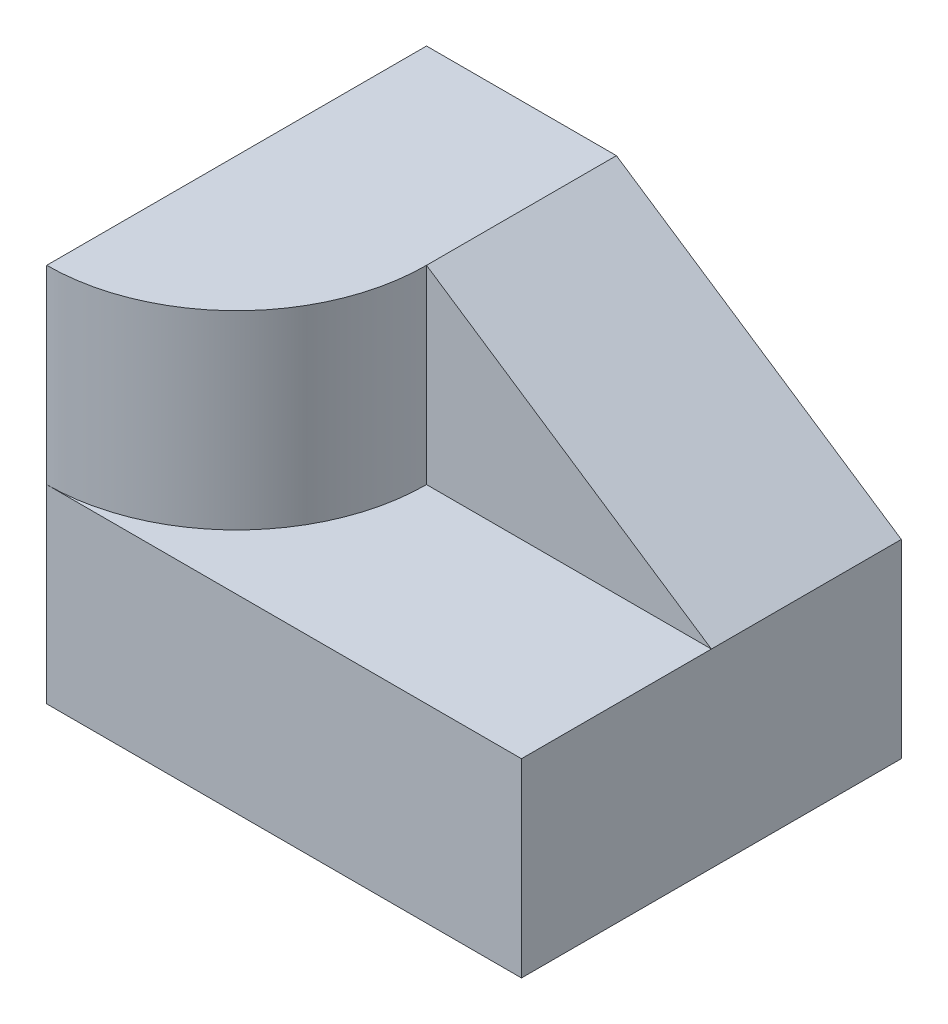
ISO-10303-21;
HEADER;
FILE_DESCRIPTION(('STEP AP214'),'2;1');
FILE_NAME('part.step','',(''),(''),'','','');
FILE_SCHEMA(('AUTOMOTIVE_DESIGN { 1 0 10303 214 1 1 1 1 }'));
ENDSEC;
DATA;
#1=APPLICATION_CONTEXT('core data for automotive mechanical design processes');
#2=APPLICATION_PROTOCOL_DEFINITION('international standard','automotive_design',2000,#1);
#3=PRODUCT_CONTEXT('',#1,'mechanical');
#4=PRODUCT('Part','Part','',(#3));
#5=PRODUCT_RELATED_PRODUCT_CATEGORY('part','',(#4));
#6=PRODUCT_DEFINITION_FORMATION('','',#4);
#7=PRODUCT_DEFINITION_CONTEXT('part definition',#1,'design');
#8=PRODUCT_DEFINITION('design','',#6,#7);
#9=PRODUCT_DEFINITION_SHAPE('','',#8);
#10=(LENGTH_UNIT() NAMED_UNIT(*) SI_UNIT(.MILLI.,.METRE.));
#11=(NAMED_UNIT(*) PLANE_ANGLE_UNIT() SI_UNIT($,.RADIAN.));
#12=(NAMED_UNIT(*) SI_UNIT($,.STERADIAN.) SOLID_ANGLE_UNIT());
#13=UNCERTAINTY_MEASURE_WITH_UNIT(LENGTH_MEASURE(1.E-05),#10,'distance_accuracy_value','');
#14=(GEOMETRIC_REPRESENTATION_CONTEXT(3) GLOBAL_UNCERTAINTY_ASSIGNED_CONTEXT((#13)) GLOBAL_UNIT_ASSIGNED_CONTEXT((#10,
#11,#12)) REPRESENTATION_CONTEXT('',''));
#15=CARTESIAN_POINT('',(0.,0.,0.));
#16=DIRECTION('',(0.,0.,1.));
#17=DIRECTION('',(1.,0.,0.));
#18=AXIS2_PLACEMENT_3D('',#15,#16,#17);
#19=CARTESIAN_POINT('',(0.,20.,0.));
#20=DIRECTION('',(0.,1.,0.));
#21=DIRECTION('',(0.,0.,1.));
#22=AXIS2_PLACEMENT_3D('',#19,#20,#21);
#23=PLANE('',#22);
#24=DIRECTION('',(-1.,0.,0.));
#25=VECTOR('',#24,1.);
#26=CARTESIAN_POINT('',(25.,20.,0.));
#27=LINE('',#26,#25);
#28=CARTESIAN_POINT('',(25.,20.,0.));
#29=VERTEX_POINT('',#28);
#30=CARTESIAN_POINT('',(-4.99999999999999,20.,-1.42247325030098E-13));
#31=VERTEX_POINT('',#30);
#32=EDGE_CURVE('E131',#29,#31,#27,.T.);
#33=ORIENTED_EDGE('',*,*,#32,.T.);
#34=CARTESIAN_POINT('',(-25.,20.,0.));
#35=DIRECTION('',(0.,1.,0.));
#36=DIRECTION('',(0.,0.,1.));
#37=AXIS2_PLACEMENT_3D('',#34,#35,#36);
#38=CIRCLE('',#37,20.);
#39=CARTESIAN_POINT('',(-25.,20.,20.));
#40=VERTEX_POINT('',#39);
#41=EDGE_CURVE('E106',#40,#31,#38,.T.);
#42=ORIENTED_EDGE('',*,*,#41,.F.);
#43=DIRECTION('',(1.,0.,0.));
#44=VECTOR('',#43,1.);
#45=CARTESIAN_POINT('',(-25.,20.,20.));
#46=LINE('',#45,#44);
#47=CARTESIAN_POINT('',(25.,20.,20.));
#48=VERTEX_POINT('',#47);
#49=EDGE_CURVE('E59',#40,#48,#46,.T.);
#50=ORIENTED_EDGE('',*,*,#49,.T.);
#51=DIRECTION('',(0.,0.,-1.));
#52=VECTOR('',#51,1.);
#53=CARTESIAN_POINT('',(25.,20.,-20.));
#54=LINE('',#53,#52);
#55=EDGE_CURVE('E142',#48,#29,#54,.T.);
#56=ORIENTED_EDGE('',*,*,#55,.T.);
#57=EDGE_LOOP('',(#33,#42,#50,#56));
#58=FACE_BOUND('',#57,.T.);
#59=ADVANCED_FACE('F36',(#58),#23,.T.);
#60=CARTESIAN_POINT('',(25.,20.,-20.));
#61=DIRECTION('',(-1.,0.,0.));
#62=DIRECTION('',(0.,0.,1.));
#63=AXIS2_PLACEMENT_3D('',#60,#61,#62);
#64=PLANE('',#63);
#65=DIRECTION('',(0.,0.,-1.));
#66=VECTOR('',#65,1.);
#67=CARTESIAN_POINT('',(25.,0.,-20.));
#68=LINE('',#67,#66);
#69=CARTESIAN_POINT('',(25.,0.,20.));
#70=VERTEX_POINT('',#69);
#71=CARTESIAN_POINT('',(25.,0.,-20.));
#72=VERTEX_POINT('',#71);
#73=EDGE_CURVE('E140',#70,#72,#68,.T.);
#74=ORIENTED_EDGE('',*,*,#73,.T.);
#75=DIRECTION('',(0.,-1.,0.));
#76=VECTOR('',#75,1.);
#77=CARTESIAN_POINT('',(25.,20.,-20.));
#78=LINE('',#77,#76);
#79=CARTESIAN_POINT('',(25.,20.,-20.));
#80=VERTEX_POINT('',#79);
#81=EDGE_CURVE('E11',#80,#72,#78,.T.);
#82=ORIENTED_EDGE('',*,*,#81,.F.);
#83=DIRECTION('',(0.,0.,-1.));
#84=VECTOR('',#83,1.);
#85=CARTESIAN_POINT('',(25.,20.,0.));
#86=LINE('',#85,#84);
#87=EDGE_CURVE('E51',#29,#80,#86,.T.);
#88=ORIENTED_EDGE('',*,*,#87,.F.);
#89=ORIENTED_EDGE('',*,*,#55,.F.);
#90=DIRECTION('',(0.,-1.,0.));
#91=VECTOR('',#90,1.);
#92=CARTESIAN_POINT('',(25.,20.,20.));
#93=LINE('',#92,#91);
#94=EDGE_CURVE('E145',#48,#70,#93,.T.);
#95=ORIENTED_EDGE('',*,*,#94,.T.);
#96=EDGE_LOOP('',(#74,#82,#88,#89,#95));
#97=FACE_BOUND('',#96,.T.);
#98=ADVANCED_FACE('F38',(#97),#64,.F.);
#99=CARTESIAN_POINT('',(-25.,20.,-20.));
#100=DIRECTION('',(0.,0.,1.));
#101=DIRECTION('',(1.,0.,0.));
#102=AXIS2_PLACEMENT_3D('',#99,#100,#101);
#103=PLANE('',#102);
#104=DIRECTION('',(-1.,0.,0.));
#105=VECTOR('',#104,1.);
#106=CARTESIAN_POINT('',(-25.,0.,-20.));
#107=LINE('',#106,#105);
#108=CARTESIAN_POINT('',(-25.,0.,-20.));
#109=VERTEX_POINT('',#108);
#110=EDGE_CURVE('E147',#72,#109,#107,.T.);
#111=ORIENTED_EDGE('',*,*,#110,.T.);
#112=DIRECTION('',(0.,-1.,0.));
#113=VECTOR('',#112,1.);
#114=CARTESIAN_POINT('',(-25.,20.,-20.));
#115=LINE('',#114,#113);
#116=CARTESIAN_POINT('',(-25.,40.,-20.));
#117=VERTEX_POINT('',#116);
#118=EDGE_CURVE('E44',#117,#109,#115,.T.);
#119=ORIENTED_EDGE('',*,*,#118,.F.);
#120=DIRECTION('',(1.,0.,0.));
#121=VECTOR('',#120,1.);
#122=CARTESIAN_POINT('',(-25.,40.,-20.));
#123=LINE('',#122,#121);
#124=CARTESIAN_POINT('',(-4.99999999999999,40.,-20.));
#125=VERTEX_POINT('',#124);
#126=EDGE_CURVE('E128',#117,#125,#123,.T.);
#127=ORIENTED_EDGE('',*,*,#126,.T.);
#128=DIRECTION('',(0.832050294337844,-0.554700196225229,0.));
#129=VECTOR('',#128,1.);
#130=CARTESIAN_POINT('',(-4.99999999999999,40.,-20.));
#131=LINE('',#130,#129);
#132=EDGE_CURVE('E127',#125,#80,#131,.T.);
#133=ORIENTED_EDGE('',*,*,#132,.T.);
#134=ORIENTED_EDGE('',*,*,#81,.T.);
#135=EDGE_LOOP('',(#111,#119,#127,#133,#134));
#136=FACE_BOUND('',#135,.T.);
#137=ADVANCED_FACE('F171',(#136),#103,.F.);
#138=CARTESIAN_POINT('',(-25.,20.,-20.));
#139=DIRECTION('',(1.,0.,0.));
#140=DIRECTION('',(0.,0.,-1.));
#141=AXIS2_PLACEMENT_3D('',#138,#139,#140);
#142=PLANE('',#141);
#143=DIRECTION('',(0.,0.,1.));
#144=VECTOR('',#143,1.);
#145=CARTESIAN_POINT('',(-25.,0.,-20.));
#146=LINE('',#145,#144);
#147=CARTESIAN_POINT('',(-25.,0.,20.));
#148=VERTEX_POINT('',#147);
#149=EDGE_CURVE('E149',#109,#148,#146,.T.);
#150=ORIENTED_EDGE('',*,*,#149,.T.);
#151=DIRECTION('',(0.,-1.,0.));
#152=VECTOR('',#151,1.);
#153=CARTESIAN_POINT('',(-25.,20.,20.));
#154=LINE('',#153,#152);
#155=EDGE_CURVE('E153',#40,#148,#154,.T.);
#156=ORIENTED_EDGE('',*,*,#155,.F.);
#157=DIRECTION('',(0.,-1.,0.));
#158=VECTOR('',#157,1.);
#159=CARTESIAN_POINT('',(-25.0000000000001,40.,20.));
#160=LINE('',#159,#158);
#161=CARTESIAN_POINT('',(-25.0000000000001,40.,20.));
#162=VERTEX_POINT('',#161);
#163=EDGE_CURVE('E110',#162,#40,#160,.T.);
#164=ORIENTED_EDGE('',*,*,#163,.F.);
#165=DIRECTION('',(0.,0.,-1.));
#166=VECTOR('',#165,1.);
#167=CARTESIAN_POINT('',(-25.0000000000001,40.,20.));
#168=LINE('',#167,#166);
#169=EDGE_CURVE('E111',#162,#117,#168,.T.);
#170=ORIENTED_EDGE('',*,*,#169,.T.);
#171=ORIENTED_EDGE('',*,*,#118,.T.);
#172=EDGE_LOOP('',(#150,#156,#164,#170,#171));
#173=FACE_BOUND('',#172,.T.);
#174=ADVANCED_FACE('F157',(#173),#142,.F.);
#175=CARTESIAN_POINT('',(-25.,20.,20.));
#176=DIRECTION('',(0.,0.,-1.));
#177=DIRECTION('',(-1.,0.,0.));
#178=AXIS2_PLACEMENT_3D('',#175,#176,#177);
#179=PLANE('',#178);
#180=DIRECTION('',(1.,0.,0.));
#181=VECTOR('',#180,1.);
#182=CARTESIAN_POINT('',(-25.,0.,20.));
#183=LINE('',#182,#181);
#184=EDGE_CURVE('E79',#148,#70,#183,.T.);
#185=ORIENTED_EDGE('',*,*,#184,.T.);
#186=ORIENTED_EDGE('',*,*,#94,.F.);
#187=ORIENTED_EDGE('',*,*,#49,.F.);
#188=ORIENTED_EDGE('',*,*,#155,.T.);
#189=EDGE_LOOP('',(#185,#186,#187,#188));
#190=FACE_BOUND('',#189,.T.);
#191=ADVANCED_FACE('F163',(#190),#179,.F.);
#192=CARTESIAN_POINT('',(0.,0.,0.));
#193=DIRECTION('',(0.,1.,0.));
#194=DIRECTION('',(0.,0.,1.));
#195=AXIS2_PLACEMENT_3D('',#192,#193,#194);
#196=PLANE('',#195);
#197=ORIENTED_EDGE('',*,*,#73,.F.);
#198=ORIENTED_EDGE('',*,*,#184,.F.);
#199=ORIENTED_EDGE('',*,*,#149,.F.);
#200=ORIENTED_EDGE('',*,*,#110,.F.);
#201=EDGE_LOOP('',(#197,#198,#199,#200));
#202=FACE_BOUND('',#201,.T.);
#203=ADVANCED_FACE('F162',(#202),#196,.F.);
#204=CARTESIAN_POINT('',(-25.,40.,0.));
#205=DIRECTION('',(0.,-1.,0.));
#206=DIRECTION('',(0.,0.,-1.));
#207=AXIS2_PLACEMENT_3D('',#204,#205,#206);
#208=CYLINDRICAL_SURFACE('',#207,20.);
#209=ORIENTED_EDGE('',*,*,#41,.T.);
#210=DIRECTION('',(0.,-1.,0.));
#211=VECTOR('',#210,1.);
#212=CARTESIAN_POINT('',(-4.99999999999999,40.,-1.42247325030098E-13));
#213=LINE('',#212,#211);
#214=CARTESIAN_POINT('',(-4.99999999999999,40.,0.));
#215=VERTEX_POINT('',#214);
#216=EDGE_CURVE('E100',#215,#31,#213,.T.);
#217=ORIENTED_EDGE('',*,*,#216,.F.);
#218=CARTESIAN_POINT('',(-25.,40.,0.));
#219=DIRECTION('',(0.,1.,0.));
#220=DIRECTION('',(0.,0.,1.));
#221=AXIS2_PLACEMENT_3D('',#218,#219,#220);
#222=CIRCLE('',#221,20.);
#223=EDGE_CURVE('E104',#162,#215,#222,.T.);
#224=ORIENTED_EDGE('',*,*,#223,.F.);
#225=ORIENTED_EDGE('',*,*,#163,.T.);
#226=EDGE_LOOP('',(#209,#217,#224,#225));
#227=FACE_BOUND('',#226,.T.);
#228=ADVANCED_FACE('F102',(#227),#208,.T.);
#229=CARTESIAN_POINT('',(-25.,40.,0.));
#230=DIRECTION('',(0.,1.,0.));
#231=DIRECTION('',(0.,0.,1.));
#232=AXIS2_PLACEMENT_3D('',#229,#230,#231);
#233=PLANE('',#232);
#234=ORIENTED_EDGE('',*,*,#126,.F.);
#235=ORIENTED_EDGE('',*,*,#169,.F.);
#236=ORIENTED_EDGE('',*,*,#223,.T.);
#237=DIRECTION('',(0.,0.,1.));
#238=VECTOR('',#237,1.);
#239=CARTESIAN_POINT('',(-4.99999999999999,40.,-20.));
#240=LINE('',#239,#238);
#241=EDGE_CURVE('E117',#125,#215,#240,.T.);
#242=ORIENTED_EDGE('',*,*,#241,.F.);
#243=EDGE_LOOP('',(#234,#235,#236,#242));
#244=FACE_BOUND('',#243,.T.);
#245=ADVANCED_FACE('F116',(#244),#233,.T.);
#246=CARTESIAN_POINT('',(-4.99999999999999,40.,0.));
#247=DIRECTION('',(0.554700196225229,0.832050294337844,0.));
#248=DIRECTION('',(-0.832050294337844,0.554700196225229,0.));
#249=AXIS2_PLACEMENT_3D('',#246,#247,#248);
#250=PLANE('',#249);
#251=ORIENTED_EDGE('',*,*,#132,.F.);
#252=ORIENTED_EDGE('',*,*,#241,.T.);
#253=DIRECTION('',(0.832050294337844,-0.554700196225229,0.));
#254=VECTOR('',#253,1.);
#255=CARTESIAN_POINT('',(-4.99999999999999,40.,0.));
#256=LINE('',#255,#254);
#257=EDGE_CURVE('E125',#215,#29,#256,.T.);
#258=ORIENTED_EDGE('',*,*,#257,.T.);
#259=ORIENTED_EDGE('',*,*,#87,.T.);
#260=EDGE_LOOP('',(#251,#252,#258,#259));
#261=FACE_BOUND('',#260,.T.);
#262=ADVANCED_FACE('F124',(#261),#250,.T.);
#263=CARTESIAN_POINT('',(0.,0.,0.));
#264=DIRECTION('',(0.,0.,1.));
#265=DIRECTION('',(1.,0.,0.));
#266=AXIS2_PLACEMENT_3D('',#263,#264,#265);
#267=PLANE('',#266);
#268=ORIENTED_EDGE('',*,*,#216,.T.);
#269=ORIENTED_EDGE('',*,*,#32,.F.);
#270=ORIENTED_EDGE('',*,*,#257,.F.);
#271=EDGE_LOOP('',(#268,#269,#270));
#272=FACE_BOUND('',#271,.T.);
#273=ADVANCED_FACE('F130',(#272),#267,.T.);
#274=CLOSED_SHELL('',(#59,#98,#137,#174,#191,#203,#228,#245,#262,#273));
#275=MANIFOLD_SOLID_BREP('B2',#274);
#276=ADVANCED_BREP_SHAPE_REPRESENTATION('',(#18,#275),#14);
#277=SHAPE_DEFINITION_REPRESENTATION(#9,#276);
ENDSEC;
END-ISO-10303-21;
